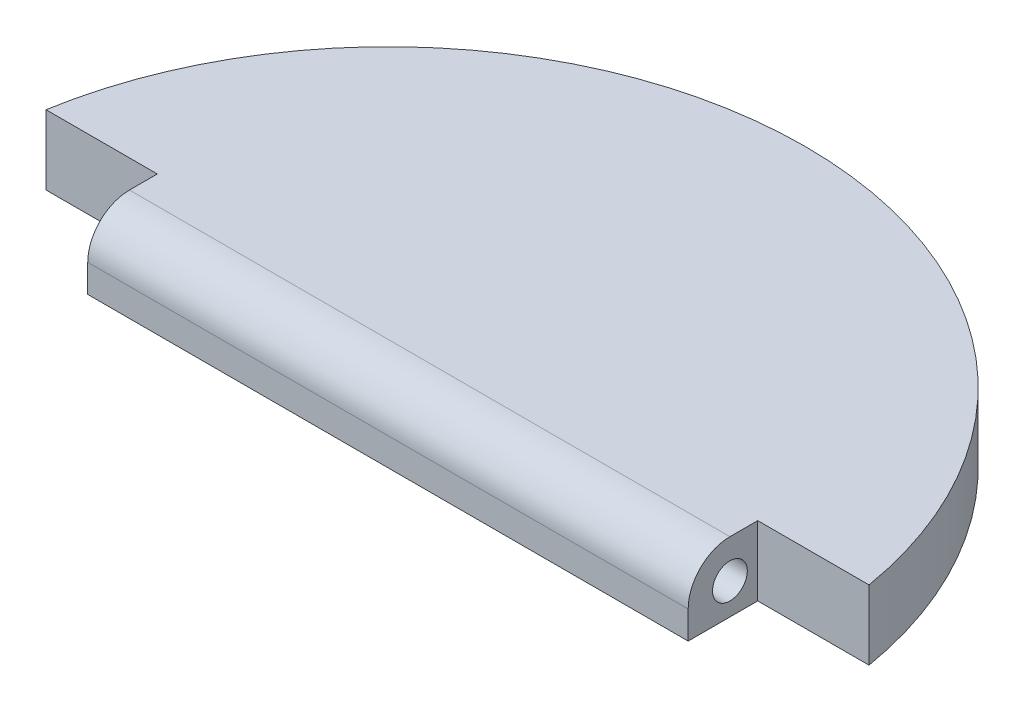
ISO-10303-21;
HEADER;
FILE_DESCRIPTION(('STEP AP214'),'2;1');
FILE_NAME('part.step','',(''),(''),'','','');
FILE_SCHEMA(('AUTOMOTIVE_DESIGN { 1 0 10303 214 1 1 1 1 }'));
ENDSEC;
DATA;
#1=APPLICATION_CONTEXT('core data for automotive mechanical design processes');
#2=APPLICATION_PROTOCOL_DEFINITION('international standard','automotive_design',2000,#1);
#3=PRODUCT_CONTEXT('',#1,'mechanical');
#4=PRODUCT('Part','Part','',(#3));
#5=PRODUCT_RELATED_PRODUCT_CATEGORY('part','',(#4));
#6=PRODUCT_DEFINITION_FORMATION('','',#4);
#7=PRODUCT_DEFINITION_CONTEXT('part definition',#1,'design');
#8=PRODUCT_DEFINITION('design','',#6,#7);
#9=PRODUCT_DEFINITION_SHAPE('','',#8);
#10=(LENGTH_UNIT() NAMED_UNIT(*) SI_UNIT(.MILLI.,.METRE.));
#11=(NAMED_UNIT(*) PLANE_ANGLE_UNIT() SI_UNIT($,.RADIAN.));
#12=(NAMED_UNIT(*) SI_UNIT($,.STERADIAN.) SOLID_ANGLE_UNIT());
#13=UNCERTAINTY_MEASURE_WITH_UNIT(LENGTH_MEASURE(1.E-05),#10,'distance_accuracy_value','');
#14=(GEOMETRIC_REPRESENTATION_CONTEXT(3) GLOBAL_UNCERTAINTY_ASSIGNED_CONTEXT((#13)) GLOBAL_UNIT_ASSIGNED_CONTEXT((#10,
#11,#12)) REPRESENTATION_CONTEXT('',''));
#15=CARTESIAN_POINT('',(0.,0.,0.));
#16=DIRECTION('',(0.,0.,1.));
#17=DIRECTION('',(1.,0.,0.));
#18=AXIS2_PLACEMENT_3D('',#15,#16,#17);
#19=CARTESIAN_POINT('',(0.,5.,0.));
#20=DIRECTION('',(0.,-1.,0.));
#21=DIRECTION('',(0.,0.,-1.));
#22=AXIS2_PLACEMENT_3D('',#19,#20,#21);
#23=CYLINDRICAL_SURFACE('',#22,30.);
#24=CARTESIAN_POINT('',(0.,0.,0.));
#25=DIRECTION('',(0.,1.,0.));
#26=DIRECTION('',(0.,0.,1.));
#27=AXIS2_PLACEMENT_3D('',#24,#25,#26);
#28=CIRCLE('',#27,30.);
#29=CARTESIAN_POINT('',(29.5803989154981,0.,-5.));
#30=VERTEX_POINT('',#29);
#31=CARTESIAN_POINT('',(-29.5803989154981,0.,-5.));
#32=VERTEX_POINT('',#31);
#33=EDGE_CURVE('E125',#30,#32,#28,.T.);
#34=ORIENTED_EDGE('',*,*,#33,.T.);
#35=DIRECTION('',(0.,1.,0.));
#36=VECTOR('',#35,1.);
#37=CARTESIAN_POINT('',(-29.5803989154981,-5.,-5.));
#38=LINE('',#37,#36);
#39=CARTESIAN_POINT('',(-29.5803989154981,5.,-5.));
#40=VERTEX_POINT('',#39);
#41=EDGE_CURVE('E113',#32,#40,#38,.T.);
#42=ORIENTED_EDGE('',*,*,#41,.T.);
#43=CARTESIAN_POINT('',(0.,5.,0.));
#44=DIRECTION('',(0.,1.,0.));
#45=DIRECTION('',(0.,0.,1.));
#46=AXIS2_PLACEMENT_3D('',#43,#44,#45);
#47=CIRCLE('',#46,30.);
#48=CARTESIAN_POINT('',(29.5803989154981,5.,-5.));
#49=VERTEX_POINT('',#48);
#50=EDGE_CURVE('E120',#49,#40,#47,.T.);
#51=ORIENTED_EDGE('',*,*,#50,.F.);
#52=DIRECTION('',(0.,1.,0.));
#53=VECTOR('',#52,1.);
#54=CARTESIAN_POINT('',(29.5803989154981,-5.,-5.));
#55=LINE('',#54,#53);
#56=EDGE_CURVE('E133',#30,#49,#55,.T.);
#57=ORIENTED_EDGE('',*,*,#56,.F.);
#58=EDGE_LOOP('',(#34,#42,#51,#57));
#59=FACE_BOUND('',#58,.T.);
#60=ADVANCED_FACE('F37',(#59),#23,.T.);
#61=CARTESIAN_POINT('',(-30.,5.,0.));
#62=DIRECTION('',(0.,0.,-1.));
#63=DIRECTION('',(-1.,0.,0.));
#64=AXIS2_PLACEMENT_3D('',#61,#62,#63);
#65=PLANE('',#64);
#66=DIRECTION('',(0.,1.,0.));
#67=VECTOR('',#66,1.);
#68=CARTESIAN_POINT('',(21.5803989154981,-5.,0.));
#69=LINE('',#68,#67);
#70=CARTESIAN_POINT('',(21.5803989154981,0.,0.));
#71=VERTEX_POINT('',#70);
#72=CARTESIAN_POINT('',(21.5803989154981,2.,0.));
#73=VERTEX_POINT('',#72);
#74=EDGE_CURVE('E105',#71,#73,#69,.T.);
#75=ORIENTED_EDGE('',*,*,#74,.T.);
#76=DIRECTION('',(1.,0.,0.));
#77=VECTOR('',#76,1.);
#78=CARTESIAN_POINT('',(-21.5803989154981,2.,0.));
#79=LINE('',#78,#77);
#80=CARTESIAN_POINT('',(-21.5803989154981,2.,0.));
#81=VERTEX_POINT('',#80);
#82=EDGE_CURVE('E45',#73,#81,#79,.F.);
#83=ORIENTED_EDGE('',*,*,#82,.T.);
#84=DIRECTION('',(0.,1.,0.));
#85=VECTOR('',#84,1.);
#86=CARTESIAN_POINT('',(-21.5803989154981,-5.,0.));
#87=LINE('',#86,#85);
#88=CARTESIAN_POINT('',(-21.5803989154981,0.,0.));
#89=VERTEX_POINT('',#88);
#90=EDGE_CURVE('E114',#89,#81,#87,.T.);
#91=ORIENTED_EDGE('',*,*,#90,.F.);
#92=DIRECTION('',(1.,0.,0.));
#93=VECTOR('',#92,1.);
#94=CARTESIAN_POINT('',(-30.,0.,0.));
#95=LINE('',#94,#93);
#96=EDGE_CURVE('E140',#89,#71,#95,.T.);
#97=ORIENTED_EDGE('',*,*,#96,.T.);
#98=EDGE_LOOP('',(#75,#83,#91,#97));
#99=FACE_BOUND('',#98,.T.);
#100=ADVANCED_FACE('F167',(#99),#65,.F.);
#101=CARTESIAN_POINT('',(0.,5.,0.));
#102=DIRECTION('',(0.,1.,0.));
#103=DIRECTION('',(0.,0.,1.));
#104=AXIS2_PLACEMENT_3D('',#101,#102,#103);
#105=PLANE('',#104);
#106=DIRECTION('',(0.,0.,-1.));
#107=VECTOR('',#106,1.);
#108=CARTESIAN_POINT('',(-21.5803989154981,5.,0.));
#109=LINE('',#108,#107);
#110=CARTESIAN_POINT('',(-21.5803989154981,5.,-3.));
#111=VERTEX_POINT('',#110);
#112=CARTESIAN_POINT('',(-21.5803989154981,5.,-5.));
#113=VERTEX_POINT('',#112);
#114=EDGE_CURVE('E94',#111,#113,#109,.T.);
#115=ORIENTED_EDGE('',*,*,#114,.F.);
#116=DIRECTION('',(1.,0.,0.));
#117=VECTOR('',#116,1.);
#118=CARTESIAN_POINT('',(21.5803989154981,5.,-3.));
#119=LINE('',#118,#117);
#120=CARTESIAN_POINT('',(21.5803989154981,5.,-3.));
#121=VERTEX_POINT('',#120);
#122=EDGE_CURVE('E153',#111,#121,#119,.T.);
#123=ORIENTED_EDGE('',*,*,#122,.T.);
#124=DIRECTION('',(0.,0.,1.));
#125=VECTOR('',#124,1.);
#126=CARTESIAN_POINT('',(21.5803989154981,5.,0.));
#127=LINE('',#126,#125);
#128=CARTESIAN_POINT('',(21.5803989154981,5.,-5.));
#129=VERTEX_POINT('',#128);
#130=EDGE_CURVE('E130',#129,#121,#127,.T.);
#131=ORIENTED_EDGE('',*,*,#130,.F.);
#132=DIRECTION('',(-1.,0.,0.));
#133=VECTOR('',#132,1.);
#134=CARTESIAN_POINT('',(21.5803989154981,5.,-5.));
#135=LINE('',#134,#133);
#136=EDGE_CURVE('E127',#49,#129,#135,.T.);
#137=ORIENTED_EDGE('',*,*,#136,.F.);
#138=ORIENTED_EDGE('',*,*,#50,.T.);
#139=DIRECTION('',(-1.,0.,0.));
#140=VECTOR('',#139,1.);
#141=CARTESIAN_POINT('',(-21.5803989154981,5.,-5.));
#142=LINE('',#141,#140);
#143=EDGE_CURVE('E104',#113,#40,#142,.T.);
#144=ORIENTED_EDGE('',*,*,#143,.F.);
#145=EDGE_LOOP('',(#115,#123,#131,#137,#138,#144));
#146=FACE_BOUND('',#145,.T.);
#147=ADVANCED_FACE('F117',(#146),#105,.T.);
#148=CARTESIAN_POINT('',(0.,0.,0.));
#149=DIRECTION('',(0.,1.,0.));
#150=DIRECTION('',(0.,0.,1.));
#151=AXIS2_PLACEMENT_3D('',#148,#149,#150);
#152=PLANE('',#151);
#153=DIRECTION('',(0.,0.,-1.));
#154=VECTOR('',#153,1.);
#155=CARTESIAN_POINT('',(-21.5803989154981,0.,0.));
#156=LINE('',#155,#154);
#157=CARTESIAN_POINT('',(-21.5803989154981,0.,-5.));
#158=VERTEX_POINT('',#157);
#159=EDGE_CURVE('E150',#89,#158,#156,.T.);
#160=ORIENTED_EDGE('',*,*,#159,.T.);
#161=DIRECTION('',(-1.,0.,0.));
#162=VECTOR('',#161,1.);
#163=CARTESIAN_POINT('',(0.,0.,-5.));
#164=LINE('',#163,#162);
#165=EDGE_CURVE('E111',#158,#32,#164,.T.);
#166=ORIENTED_EDGE('',*,*,#165,.T.);
#167=ORIENTED_EDGE('',*,*,#33,.F.);
#168=DIRECTION('',(-1.,0.,0.));
#169=VECTOR('',#168,1.);
#170=CARTESIAN_POINT('',(0.,0.,-5.));
#171=LINE('',#170,#169);
#172=CARTESIAN_POINT('',(21.5803989154981,0.,-5.));
#173=VERTEX_POINT('',#172);
#174=EDGE_CURVE('E139',#30,#173,#171,.T.);
#175=ORIENTED_EDGE('',*,*,#174,.T.);
#176=DIRECTION('',(0.,0.,1.));
#177=VECTOR('',#176,1.);
#178=CARTESIAN_POINT('',(21.5803989154981,0.,0.));
#179=LINE('',#178,#177);
#180=EDGE_CURVE('E147',#173,#71,#179,.T.);
#181=ORIENTED_EDGE('',*,*,#180,.T.);
#182=ORIENTED_EDGE('',*,*,#96,.F.);
#183=EDGE_LOOP('',(#160,#166,#167,#175,#181,#182));
#184=FACE_BOUND('',#183,.T.);
#185=ADVANCED_FACE('F165',(#184),#152,.F.);
#186=CARTESIAN_POINT('',(21.5803989154981,-5.,0.));
#187=DIRECTION('',(-1.,0.,0.));
#188=DIRECTION('',(0.,0.,1.));
#189=AXIS2_PLACEMENT_3D('',#186,#187,#188);
#190=PLANE('',#189);
#191=CARTESIAN_POINT('',(21.5803989154981,2.25,-3.));
#192=DIRECTION('',(1.,0.,0.));
#193=DIRECTION('',(0.,0.,-1.));
#194=AXIS2_PLACEMENT_3D('',#191,#192,#193);
#195=CIRCLE('',#194,1.25);
#196=CARTESIAN_POINT('',(21.5803989154981,2.25,-4.25));
#197=VERTEX_POINT('',#196);
#198=EDGE_CURVE('E211',#197,#197,#195,.T.);
#199=ORIENTED_EDGE('',*,*,#198,.F.);
#200=EDGE_LOOP('',(#199));
#201=FACE_BOUND('',#200,.T.);
#202=ORIENTED_EDGE('',*,*,#130,.T.);
#203=CARTESIAN_POINT('',(21.5803989154981,2.,-3.));
#204=DIRECTION('',(-1.,0.,0.));
#205=DIRECTION('',(0.,0.,1.));
#206=AXIS2_PLACEMENT_3D('',#203,#204,#205);
#207=CIRCLE('',#206,3.);
#208=EDGE_CURVE('E59',#121,#73,#207,.F.);
#209=ORIENTED_EDGE('',*,*,#208,.T.);
#210=ORIENTED_EDGE('',*,*,#74,.F.);
#211=ORIENTED_EDGE('',*,*,#180,.F.);
#212=DIRECTION('',(0.,1.,0.));
#213=VECTOR('',#212,1.);
#214=CARTESIAN_POINT('',(21.5803989154981,-5.,-5.));
#215=LINE('',#214,#213);
#216=EDGE_CURVE('E135',#173,#129,#215,.T.);
#217=ORIENTED_EDGE('',*,*,#216,.T.);
#218=EDGE_LOOP('',(#202,#209,#210,#211,#217));
#219=FACE_BOUND('',#218,.T.);
#220=ADVANCED_FACE('F157',(#201,#219),#190,.F.);
#221=CARTESIAN_POINT('',(21.5803989154981,-5.,-5.));
#222=DIRECTION('',(0.,0.,-1.));
#223=DIRECTION('',(-1.,0.,0.));
#224=AXIS2_PLACEMENT_3D('',#221,#222,#223);
#225=PLANE('',#224);
#226=ORIENTED_EDGE('',*,*,#56,.T.);
#227=ORIENTED_EDGE('',*,*,#136,.T.);
#228=ORIENTED_EDGE('',*,*,#216,.F.);
#229=ORIENTED_EDGE('',*,*,#174,.F.);
#230=EDGE_LOOP('',(#226,#227,#228,#229));
#231=FACE_BOUND('',#230,.T.);
#232=ADVANCED_FACE('F160',(#231),#225,.F.);
#233=CARTESIAN_POINT('',(-21.5803989154981,-5.,-5.));
#234=DIRECTION('',(0.,0.,-1.));
#235=DIRECTION('',(-1.,0.,0.));
#236=AXIS2_PLACEMENT_3D('',#233,#234,#235);
#237=PLANE('',#236);
#238=DIRECTION('',(0.,1.,0.));
#239=VECTOR('',#238,1.);
#240=CARTESIAN_POINT('',(-21.5803989154981,-5.,-5.));
#241=LINE('',#240,#239);
#242=EDGE_CURVE('E97',#158,#113,#241,.T.);
#243=ORIENTED_EDGE('',*,*,#242,.T.);
#244=ORIENTED_EDGE('',*,*,#143,.T.);
#245=ORIENTED_EDGE('',*,*,#41,.F.);
#246=ORIENTED_EDGE('',*,*,#165,.F.);
#247=EDGE_LOOP('',(#243,#244,#245,#246));
#248=FACE_BOUND('',#247,.T.);
#249=ADVANCED_FACE('F108',(#248),#237,.F.);
#250=CARTESIAN_POINT('',(-21.5803989154981,-5.,0.));
#251=DIRECTION('',(1.,0.,0.));
#252=DIRECTION('',(0.,0.,-1.));
#253=AXIS2_PLACEMENT_3D('',#250,#251,#252);
#254=PLANE('',#253);
#255=CARTESIAN_POINT('',(-21.5803989154981,2.25,-3.));
#256=DIRECTION('',(-1.,0.,0.));
#257=DIRECTION('',(0.,0.,1.));
#258=AXIS2_PLACEMENT_3D('',#255,#256,#257);
#259=CIRCLE('',#258,1.25);
#260=CARTESIAN_POINT('',(-21.5803989154981,2.25,-1.75));
#261=VERTEX_POINT('',#260);
#262=EDGE_CURVE('E212',#261,#261,#259,.T.);
#263=ORIENTED_EDGE('',*,*,#262,.F.);
#264=EDGE_LOOP('',(#263));
#265=FACE_BOUND('',#264,.T.);
#266=ORIENTED_EDGE('',*,*,#90,.T.);
#267=CARTESIAN_POINT('',(-21.5803989154981,2.,-3.));
#268=DIRECTION('',(1.,0.,0.));
#269=DIRECTION('',(0.,0.,-1.));
#270=AXIS2_PLACEMENT_3D('',#267,#268,#269);
#271=CIRCLE('',#270,3.);
#272=EDGE_CURVE('E11',#81,#111,#271,.F.);
#273=ORIENTED_EDGE('',*,*,#272,.T.);
#274=ORIENTED_EDGE('',*,*,#114,.T.);
#275=ORIENTED_EDGE('',*,*,#242,.F.);
#276=ORIENTED_EDGE('',*,*,#159,.F.);
#277=EDGE_LOOP('',(#266,#273,#274,#275,#276));
#278=FACE_BOUND('',#277,.T.);
#279=ADVANCED_FACE('F96',(#265,#278),#254,.F.);
#280=CARTESIAN_POINT('',(0.,2.,-3.));
#281=DIRECTION('',(-1.,0.,0.));
#282=DIRECTION('',(0.,0.,1.));
#283=AXIS2_PLACEMENT_3D('',#280,#281,#282);
#284=CYLINDRICAL_SURFACE('',#283,3.);
#285=ORIENTED_EDGE('',*,*,#272,.F.);
#286=ORIENTED_EDGE('',*,*,#82,.F.);
#287=ORIENTED_EDGE('',*,*,#208,.F.);
#288=ORIENTED_EDGE('',*,*,#122,.F.);
#289=EDGE_LOOP('',(#285,#286,#287,#288));
#290=FACE_BOUND('',#289,.T.);
#291=ADVANCED_FACE('F39',(#290),#284,.T.);
#292=CARTESIAN_POINT('',(18.5803989154981,2.25,-3.));
#293=DIRECTION('',(1.,0.,0.));
#294=DIRECTION('',(0.,0.,-1.));
#295=AXIS2_PLACEMENT_3D('',#292,#293,#294);
#296=CYLINDRICAL_SURFACE('',#295,1.25);
#297=CARTESIAN_POINT('',(18.5803989154981,2.25,-3.));
#298=DIRECTION('',(1.,0.,0.));
#299=DIRECTION('',(0.,0.,-1.));
#300=AXIS2_PLACEMENT_3D('',#297,#298,#299);
#301=CIRCLE('',#300,1.25);
#302=CARTESIAN_POINT('',(18.5803989154981,2.25,-4.25));
#303=VERTEX_POINT('',#302);
#304=EDGE_CURVE('E131',#303,#303,#301,.T.);
#305=ORIENTED_EDGE('',*,*,#304,.F.);
#306=EDGE_LOOP('',(#305));
#307=FACE_BOUND('',#306,.T.);
#308=ORIENTED_EDGE('',*,*,#198,.T.);
#309=EDGE_LOOP('',(#308));
#310=FACE_BOUND('',#309,.T.);
#311=ADVANCED_FACE('F169',(#307,#310),#296,.F.);
#312=CARTESIAN_POINT('',(18.5803989154981,2.25,-3.));
#313=DIRECTION('',(1.,0.,0.));
#314=DIRECTION('',(0.,0.,-1.));
#315=AXIS2_PLACEMENT_3D('',#312,#313,#314);
#316=PLANE('',#315);
#317=ORIENTED_EDGE('',*,*,#304,.T.);
#318=EDGE_LOOP('',(#317));
#319=FACE_BOUND('',#318,.T.);
#320=ADVANCED_FACE('F174',(#319),#316,.T.);
#321=CARTESIAN_POINT('',(-18.5803989154981,2.25,-3.));
#322=DIRECTION('',(-1.,0.,0.));
#323=DIRECTION('',(0.,0.,1.));
#324=AXIS2_PLACEMENT_3D('',#321,#322,#323);
#325=CYLINDRICAL_SURFACE('',#324,1.25);
#326=CARTESIAN_POINT('',(-18.5803989154981,2.25,-3.));
#327=DIRECTION('',(-1.,0.,0.));
#328=DIRECTION('',(0.,0.,1.));
#329=AXIS2_PLACEMENT_3D('',#326,#327,#328);
#330=CIRCLE('',#329,1.25);
#331=CARTESIAN_POINT('',(-18.5803989154981,2.25,-1.75));
#332=VERTEX_POINT('',#331);
#333=EDGE_CURVE('E210',#332,#332,#330,.T.);
#334=ORIENTED_EDGE('',*,*,#333,.F.);
#335=EDGE_LOOP('',(#334));
#336=FACE_BOUND('',#335,.T.);
#337=ORIENTED_EDGE('',*,*,#262,.T.);
#338=EDGE_LOOP('',(#337));
#339=FACE_BOUND('',#338,.T.);
#340=ADVANCED_FACE('F198',(#336,#339),#325,.F.);
#341=CARTESIAN_POINT('',(-18.5803989154981,2.25,-3.));
#342=DIRECTION('',(-1.,0.,0.));
#343=DIRECTION('',(0.,0.,1.));
#344=AXIS2_PLACEMENT_3D('',#341,#342,#343);
#345=PLANE('',#344);
#346=ORIENTED_EDGE('',*,*,#333,.T.);
#347=EDGE_LOOP('',(#346));
#348=FACE_BOUND('',#347,.T.);
#349=ADVANCED_FACE('F202',(#348),#345,.T.);
#350=CLOSED_SHELL('',(#60,#100,#147,#185,#220,#232,#249,#279,#291,#311,#320,#340,#349));
#351=MANIFOLD_SOLID_BREP('B2',#350);
#352=ADVANCED_BREP_SHAPE_REPRESENTATION('',(#18,#351),#14);
#353=SHAPE_DEFINITION_REPRESENTATION(#9,#352);
ENDSEC;
END-ISO-10303-21;
